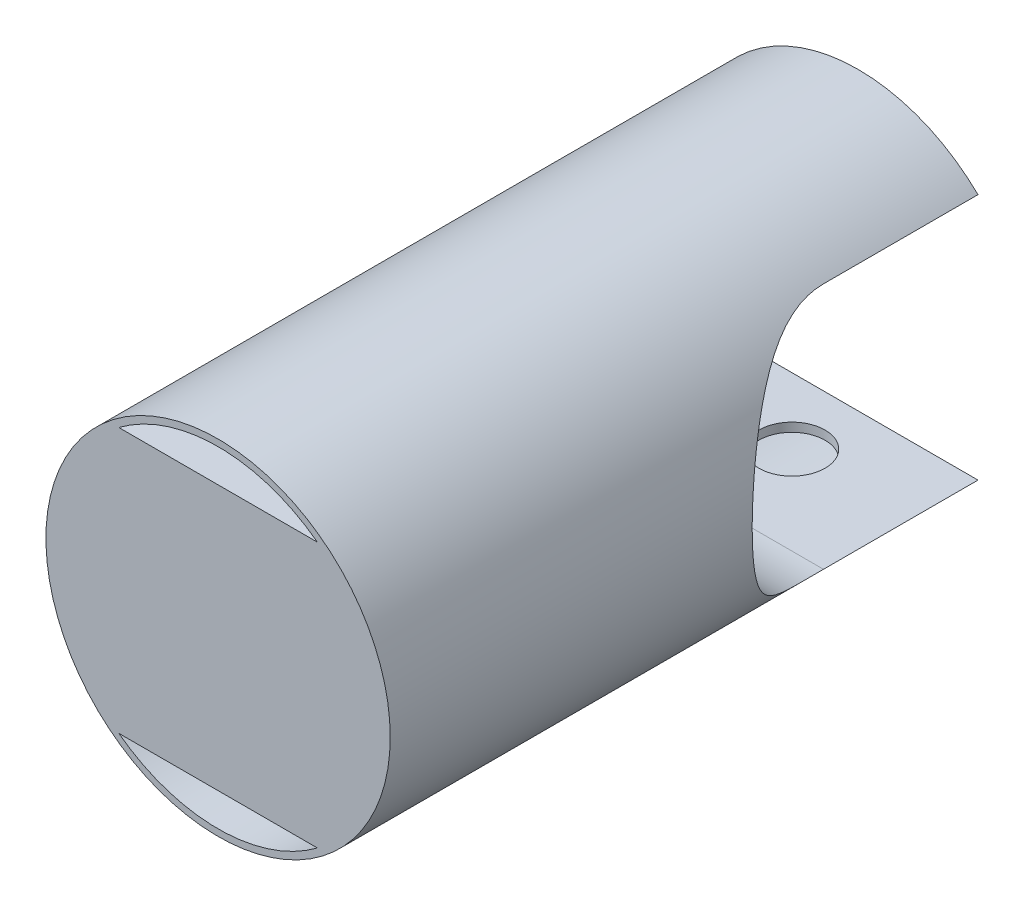
ISO-10303-21;
HEADER;
FILE_DESCRIPTION(('STEP AP214'),'2;1');
FILE_NAME('part.step','',(''),(''),'','','');
FILE_SCHEMA(('AUTOMOTIVE_DESIGN { 1 0 10303 214 1 1 1 1 }'));
ENDSEC;
DATA;
#1=APPLICATION_CONTEXT('core data for automotive mechanical design processes');
#2=APPLICATION_PROTOCOL_DEFINITION('international standard','automotive_design',2000,#1);
#3=PRODUCT_CONTEXT('',#1,'mechanical');
#4=PRODUCT('Part','Part','',(#3));
#5=PRODUCT_RELATED_PRODUCT_CATEGORY('part','',(#4));
#6=PRODUCT_DEFINITION_FORMATION('','',#4);
#7=PRODUCT_DEFINITION_CONTEXT('part definition',#1,'design');
#8=PRODUCT_DEFINITION('design','',#6,#7);
#9=PRODUCT_DEFINITION_SHAPE('','',#8);
#10=(LENGTH_UNIT() NAMED_UNIT(*) SI_UNIT(.MILLI.,.METRE.));
#11=(NAMED_UNIT(*) PLANE_ANGLE_UNIT() SI_UNIT($,.RADIAN.));
#12=(NAMED_UNIT(*) SI_UNIT($,.STERADIAN.) SOLID_ANGLE_UNIT());
#13=UNCERTAINTY_MEASURE_WITH_UNIT(LENGTH_MEASURE(1.E-05),#10,'distance_accuracy_value','');
#14=(GEOMETRIC_REPRESENTATION_CONTEXT(3) GLOBAL_UNCERTAINTY_ASSIGNED_CONTEXT((#13)) GLOBAL_UNIT_ASSIGNED_CONTEXT((#10,
#11,#12)) REPRESENTATION_CONTEXT('',''));
#15=CARTESIAN_POINT('',(0.,0.,0.));
#16=DIRECTION('',(0.,0.,1.));
#17=DIRECTION('',(1.,0.,0.));
#18=AXIS2_PLACEMENT_3D('',#15,#16,#17);
#19=CARTESIAN_POINT('',(0.,0.,0.));
#20=DIRECTION('',(0.,0.,1.));
#21=DIRECTION('',(1.,0.,0.));
#22=AXIS2_PLACEMENT_3D('',#19,#20,#21);
#23=PLANE('',#22);
#24=DIRECTION('',(1.,0.,0.));
#25=VECTOR('',#24,1.);
#26=CARTESIAN_POINT('',(0.,30.,0.));
#27=LINE('',#26,#25);
#28=CARTESIAN_POINT('',(-22.5,30.,0.));
#29=VERTEX_POINT('',#28);
#30=CARTESIAN_POINT('',(22.5,30.,0.));
#31=VERTEX_POINT('',#30);
#32=EDGE_CURVE('E130',#29,#31,#27,.T.);
#33=ORIENTED_EDGE('',*,*,#32,.T.);
#34=CARTESIAN_POINT('',(0.,0.,0.));
#35=DIRECTION('',(0.,0.,1.));
#36=DIRECTION('',(1.,0.,0.));
#37=AXIS2_PLACEMENT_3D('',#34,#35,#36);
#38=CIRCLE('',#37,37.5);
#39=EDGE_CURVE('E133',#31,#29,#38,.T.);
#40=ORIENTED_EDGE('',*,*,#39,.T.);
#41=EDGE_LOOP('',(#33,#40));
#42=FACE_BOUND('',#41,.T.);
#43=CARTESIAN_POINT('',(0.,0.,0.));
#44=DIRECTION('',(0.,0.,1.));
#45=DIRECTION('',(1.,0.,0.));
#46=AXIS2_PLACEMENT_3D('',#43,#44,#45);
#47=CIRCLE('',#46,39.);
#48=CARTESIAN_POINT('',(27.1477439209965,28.,0.));
#49=VERTEX_POINT('',#48);
#50=CARTESIAN_POINT('',(-27.1477439209965,28.,0.));
#51=VERTEX_POINT('',#50);
#52=EDGE_CURVE('E185',#49,#51,#47,.T.);
#53=ORIENTED_EDGE('',*,*,#52,.F.);
#54=DIRECTION('',(-1.,0.,0.));
#55=VECTOR('',#54,1.);
#56=CARTESIAN_POINT('',(0.,28.,0.));
#57=LINE('',#56,#55);
#58=EDGE_CURVE('E46',#49,#51,#57,.T.);
#59=ORIENTED_EDGE('',*,*,#58,.T.);
#60=EDGE_LOOP('',(#53,#59));
#61=FACE_BOUND('',#60,.T.);
#62=ADVANCED_FACE('F37',(#42,#61),#23,.F.);
#63=CARTESIAN_POINT('',(0.,0.,145.));
#64=DIRECTION('',(0.,0.,-1.));
#65=DIRECTION('',(-1.,0.,0.));
#66=AXIS2_PLACEMENT_3D('',#63,#64,#65);
#67=CYLINDRICAL_SURFACE('',#66,39.);
#68=CARTESIAN_POINT('',(0.,0.,145.));
#69=DIRECTION('',(0.,0.,1.));
#70=DIRECTION('',(1.,0.,0.));
#71=AXIS2_PLACEMENT_3D('',#68,#69,#70);
#72=CIRCLE('',#71,39.);
#73=CARTESIAN_POINT('',(39.,0.,145.));
#74=VERTEX_POINT('',#73);
#75=EDGE_CURVE('E189',#74,#74,#72,.T.);
#76=ORIENTED_EDGE('',*,*,#75,.F.);
#77=EDGE_LOOP('',(#76));
#78=FACE_BOUND('',#77,.T.);
#79=CARTESIAN_POINT('',(39.,0.,63.));
#80=CARTESIAN_POINT('',(39.0000026610636,0.692124637936485,63.0000028327298));
#81=CARTESIAN_POINT('',(38.9815388813387,1.38421584483747,62.9743031819958));
#82=CARTESIAN_POINT('',(38.9081504730498,2.76262539698867,62.871947432724));
#83=CARTESIAN_POINT('',(38.8532281538022,3.44894410508601,62.7952945616081));
#84=CARTESIAN_POINT('',(38.708232350775,4.81058641949559,62.5922505690083));
#85=CARTESIAN_POINT('',(38.6181483743368,5.48590668101644,62.465844600511));
#86=CARTESIAN_POINT('',(38.4049214408412,6.82046224940038,62.1652205891098));
#87=CARTESIAN_POINT('',(38.2817775118207,7.47969708273001,61.9910011404858));
#88=CARTESIAN_POINT('',(38.0058339837218,8.77454368572793,61.5981737768166));
#89=CARTESIAN_POINT('',(37.8531888949309,9.41025882097758,61.3797968690784));
#90=CARTESIAN_POINT('',(37.5209241641779,10.658201024066,60.9007628012948));
#91=CARTESIAN_POINT('',(37.3413047573936,11.2704282966272,60.6401060098682));
#92=CARTESIAN_POINT('',(36.9584384675143,12.46874095461,60.0792378673774));
#93=CARTESIAN_POINT('',(36.7551919176368,13.0548267085484,59.7790270741416));
#94=CARTESIAN_POINT('',(36.3285651503581,14.1988785961172,59.141679658016));
#95=CARTESIAN_POINT('',(36.1051839445667,14.7568433472171,58.8045412222099));
#96=CARTESIAN_POINT('',(35.6210340047735,15.8920142342519,58.0639015895301));
#97=CARTESIAN_POINT('',(35.3587094915667,16.4664409731788,57.6571591564337));
#98=CARTESIAN_POINT('',(34.8191052852505,17.5787394957036,56.8054733213147));
#99=CARTESIAN_POINT('',(34.541824864907,18.1166094988433,56.360528061048));
#100=CARTESIAN_POINT('',(33.9767173742283,19.1554895834412,55.4340963657595));
#101=CARTESIAN_POINT('',(33.6888762265339,19.6564475737781,54.9525601670058));
#102=CARTESIAN_POINT('',(33.107992026515,20.6198282172315,53.9553003294653));
#103=CARTESIAN_POINT('',(32.8149486843545,21.0822487150375,53.4395747814416));
#104=CARTESIAN_POINT('',(32.1743714619999,22.0500820023418,52.2762293705415));
#105=CARTESIAN_POINT('',(31.8268418512232,22.547490188065,51.6219207260547));
#106=CARTESIAN_POINT('',(31.1413794376193,23.4851407154712,50.2684679855663));
#107=CARTESIAN_POINT('',(30.8034493027458,23.9253672839688,49.5693115977129));
#108=CARTESIAN_POINT('',(30.1486225731739,24.7454138328814,48.1282526689309));
#109=CARTESIAN_POINT('',(29.8317011565603,25.1253058676929,47.3864025801973));
#110=CARTESIAN_POINT('',(29.2312007848053,25.8214664966004,45.8606700609138));
#111=CARTESIAN_POINT('',(28.9476036471078,26.1377698538679,45.076810894737));
#112=CARTESIAN_POINT('',(28.5121703842588,26.6105912953908,43.7297376441368));
#113=CARTESIAN_POINT('',(28.3473890461957,26.7856977139033,43.1771796951025));
#114=CARTESIAN_POINT('',(28.0444004339599,27.1027618968687,42.0554799816854));
#115=CARTESIAN_POINT('',(27.9061889181048,27.2447249532,41.4863408810989));
#116=CARTESIAN_POINT('',(27.6612492899566,27.4933770484771,40.3348346392674));
#117=CARTESIAN_POINT('',(27.5544630912269,27.6001312120885,39.7524940738783));
#118=CARTESIAN_POINT('',(27.3762028574204,27.7769573582757,38.5768553288156));
#119=CARTESIAN_POINT('',(27.3047287728776,27.8470293922366,37.9835571644929));
#120=CARTESIAN_POINT('',(27.199863270364,27.9494709236467,36.7861984101292));
#121=CARTESIAN_POINT('',(27.1667355255247,27.9815794120525,36.1820919735026));
#122=CARTESIAN_POINT('',(27.14102104006,28.0065226884135,34.9722143934562));
#123=CARTESIAN_POINT('',(27.1484329870293,27.9993587477486,34.3664433045614));
#124=CARTESIAN_POINT('',(27.2034577951029,27.9458999285814,33.1580705131129));
#125=CARTESIAN_POINT('',(27.2510984463809,27.8995779995367,32.5554712913329));
#126=CARTESIAN_POINT('',(27.3843963971215,27.7687496504236,31.3587011813297));
#127=CARTESIAN_POINT('',(27.4700579948154,27.6842389131279,30.7645312538695));
#128=CARTESIAN_POINT('',(27.6885562049167,27.4658073417692,29.5154942026279));
#129=CARTESIAN_POINT('',(27.8259357725411,27.3270476956264,28.862271433632));
#130=CARTESIAN_POINT('',(28.1376872317888,27.0059340027621,27.5757560015394));
#131=CARTESIAN_POINT('',(28.3120647116067,26.8235733699834,26.9424663657711));
#132=CARTESIAN_POINT('',(28.6912366262835,26.4176102804025,25.6973387854608));
#133=CARTESIAN_POINT('',(28.8960868221698,26.1939320325336,25.0855427630964));
#134=CARTESIAN_POINT('',(29.3292507542327,25.7079953318367,23.8861445160571));
#135=CARTESIAN_POINT('',(29.5575665861936,25.4457334320862,23.2985444589703));
#136=CARTESIAN_POINT('',(30.1067248065143,24.7955422490142,21.9657420468813));
#137=CARTESIAN_POINT('',(30.4339347842966,24.3941464813334,21.2297097728718));
#138=CARTESIAN_POINT('',(31.105915659169,23.5312831739085,19.8021492352274));
#139=CARTESIAN_POINT('',(31.4506916436716,23.0697981704127,19.1106339972453));
#140=CARTESIAN_POINT('',(32.1472921848713,22.0887719268916,17.7728512844802));
#141=CARTESIAN_POINT('',(32.4991224486433,21.5691819835716,17.126622517789));
#142=CARTESIAN_POINT('',(33.1999431420482,20.4740431608154,15.8819295587248));
#143=CARTESIAN_POINT('',(33.5489338642229,19.8985001270859,15.2834603885317));
#144=CARTESIAN_POINT('',(34.2390190081888,18.6863867960931,14.1307468185303));
#145=CARTESIAN_POINT('',(34.5799893887016,18.0492306864368,13.5770426383918));
#146=CARTESIAN_POINT('',(35.2415268204184,16.720812084751,12.5248466311015));
#147=CARTESIAN_POINT('',(35.5620918107511,16.0295441432912,12.0263603770112));
#148=CARTESIAN_POINT('',(36.1738518741793,14.5964968660522,11.0903204474324));
#149=CARTESIAN_POINT('',(36.465102725648,13.854818137674,10.6526504237158));
#150=CARTESIAN_POINT('',(36.87414756659,12.7067889806278,10.0455416956756));
#151=CARTESIAN_POINT('',(37.0058465357597,12.3182311260715,9.85142028425292));
#152=CARTESIAN_POINT('',(37.2590742005733,11.5296523862216,9.48026168579437));
#153=CARTESIAN_POINT('',(37.3806003534072,11.1296286682509,9.30322876853689));
#154=CARTESIAN_POINT('',(37.6689887002913,10.121283722037,8.88514730481906));
#155=CARTESIAN_POINT('',(37.8290810365736,9.50646007853193,8.65494887003213));
#156=CARTESIAN_POINT('',(38.1214548436868,8.25631277703023,8.23682294921956));
#157=CARTESIAN_POINT('',(38.2537423284692,7.6209935864065,8.04888632171094));
#158=CARTESIAN_POINT('',(38.4878269895827,6.33363070152342,7.71765111779461));
#159=CARTESIAN_POINT('',(38.5896401387526,5.68159596382048,7.57432915544488));
#160=CARTESIAN_POINT('',(38.7606725033535,4.36475333171255,7.334193592339));
#161=CARTESIAN_POINT('',(38.8298908186358,3.6999450850781,7.23738127600576));
#162=CARTESIAN_POINT('',(38.9343359049962,2.36017428614593,7.0914865457536));
#163=CARTESIAN_POINT('',(38.9694482657465,1.68518521716494,7.0425647791014));
#164=CARTESIAN_POINT('',(39.0044503969232,0.33251826546885,6.99379637694701));
#165=CARTESIAN_POINT('',(39.0043402394116,-0.345159611742342,6.99394964104165));
#166=CARTESIAN_POINT('',(38.9688996421112,-1.69784367396269,7.04332939580377));
#167=CARTESIAN_POINT('',(38.9335663759143,-2.37284964020575,7.09255982457048));
#168=CARTESIAN_POINT('',(38.8285057591689,-3.71485413532504,7.23931767483063));
#169=CARTESIAN_POINT('',(38.7587791119185,-4.38185282765348,7.33684410873647));
#170=CARTESIAN_POINT('',(38.5908513000108,-5.66980263661009,7.57263632651303));
#171=CARTESIAN_POINT('',(38.4942534083896,-6.29138557423201,7.70861387629631));
#172=CARTESIAN_POINT('',(38.2733680803712,-7.51920061745279,8.02106542222191));
#173=CARTESIAN_POINT('',(38.149081792952,-8.12543335887245,8.19753773797286));
#174=CARTESIAN_POINT('',(37.8750963784416,-9.31946083397191,8.58897086505218));
#175=CARTESIAN_POINT('',(37.7253949990027,-9.90725392801021,8.80393508772011));
#176=CARTESIAN_POINT('',(37.4031573549767,-11.0617856590684,9.2701621391572));
#177=CARTESIAN_POINT('',(37.2306197720378,-11.6285230781067,9.52142706367105));
#178=CARTESIAN_POINT('',(36.8492378653406,-12.7882208318174,10.0818903343462));
#179=CARTESIAN_POINT('',(36.6385298569248,-13.3790384083497,10.3942522589166));
#180=CARTESIAN_POINT('',(36.1970051917088,-14.531261378437,11.0566471745277));
#181=CARTESIAN_POINT('',(35.9661875594172,-15.0926653430586,11.406681993225));
#182=CARTESIAN_POINT('',(35.4880826492587,-16.1849187883584,12.1421314656885));
#183=CARTESIAN_POINT('',(35.2407857263825,-16.715750030535,12.5275668895552));
#184=CARTESIAN_POINT('',(34.7336824260474,-17.7454427345512,13.3314522285671));
#185=CARTESIAN_POINT('',(34.4738754034699,-18.2443025445951,13.7499038469976));
#186=CARTESIAN_POINT('',(33.8976468822037,-19.296939963031,14.6968889353503));
#187=CARTESIAN_POINT('',(33.5795155107402,-19.8442280812716,15.2316097241104));
#188=CARTESIAN_POINT('',(32.9378902879347,-20.8919318488171,16.3422888056949));
#189=CARTESIAN_POINT('',(32.6143955565276,-21.3923397142068,16.9182539187425));
#190=CARTESIAN_POINT('',(31.9690275680434,-22.3453037704146,18.1100640701929));
#191=CARTESIAN_POINT('',(31.6471554648052,-22.7978295225458,18.7259340798712));
#192=CARTESIAN_POINT('',(31.0131633491871,-23.6530525596973,19.9960296356406));
#193=CARTESIAN_POINT('',(30.7010417329402,-24.055758072301,20.6502488221699));
#194=CARTESIAN_POINT('',(30.139736208305,-24.7541250652467,21.8978290224601));
#195=CARTESIAN_POINT('',(29.8880205523411,-25.0568294120923,22.4861116684183));
#196=CARTESIAN_POINT('',(29.4044958866962,-25.6225302362712,23.6894784619492));
#197=CARTESIAN_POINT('',(29.1726868870132,-25.8855266936616,24.3045626229826));
#198=CARTESIAN_POINT('',(28.7363984831913,-26.3690217370343,25.5593461536721));
#199=CARTESIAN_POINT('',(28.5318723457638,-26.5895932874662,26.1990009500413));
#200=CARTESIAN_POINT('',(28.1572902951255,-26.9859500044433,27.5018837011271));
#201=CARTESIAN_POINT('',(27.9872255947728,-27.1617465908673,28.1651055957689));
#202=CARTESIAN_POINT('',(27.7181240778243,-27.4360164119103,29.3808909331272));
#203=CARTESIAN_POINT('',(27.6117074965966,-27.5428757459626,29.9299344363352));
#204=CARTESIAN_POINT('',(27.4298238302203,-27.7240205773417,31.038444954536));
#205=CARTESIAN_POINT('',(27.3543528270422,-27.7983101984129,31.5979106405903));
#206=CARTESIAN_POINT('',(27.2373031615743,-27.9130090851952,32.723277504621));
#207=CARTESIAN_POINT('',(27.1956899005787,-27.9534529385855,33.2891715122837));
#208=CARTESIAN_POINT('',(27.1479395895867,-27.9998305580728,34.423894745306));
#209=CARTESIAN_POINT('',(27.1418029864982,-28.0057638894326,34.9927240075513));
#210=CARTESIAN_POINT('',(27.1652744880456,-27.9829969127398,36.1291779061756));
#211=CARTESIAN_POINT('',(27.1948975916678,-27.9542820719233,36.6968019369702));
#212=CARTESIAN_POINT('',(27.2886697393525,-27.8627484031369,37.8263727166209));
#213=CARTESIAN_POINT('',(27.3528186710311,-27.7999296861776,38.3883194839509));
#214=CARTESIAN_POINT('',(27.5132220003846,-27.6411884563352,39.5036016878148));
#215=CARTESIAN_POINT('',(27.6095191865239,-27.5452218185291,40.056924613408));
#216=CARTESIAN_POINT('',(27.8307566069062,-27.3216700192784,41.1512946965837));
#217=CARTESIAN_POINT('',(27.9557007898587,-27.1940804987309,41.6923401505269));
#218=CARTESIAN_POINT('',(28.2756362446052,-26.8618255786581,42.936131206314));
#219=CARTESIAN_POINT('',(28.4801395295399,-26.6456179774903,43.6333636485254));
#220=CARTESIAN_POINT('',(28.9234633071678,-26.1637219282283,44.999231957808));
#221=CARTESIAN_POINT('',(29.162295796207,-25.8980161733474,45.6678577218373));
#222=CARTESIAN_POINT('',(29.6656290048797,-25.3199031884026,46.9755681912413));
#223=CARTESIAN_POINT('',(29.9301619603276,-25.0074370349304,47.6146142731545));
#224=CARTESIAN_POINT('',(30.4765849982717,-24.3385346543871,48.861319667706));
#225=CARTESIAN_POINT('',(30.7584738073295,-23.9821016513426,49.4689812770928));
#226=CARTESIAN_POINT('',(31.3404824276869,-23.2166250948072,50.6687122278047));
#227=CARTESIAN_POINT('',(31.6408907929682,-22.8063996454335,51.2598862977083));
#228=CARTESIAN_POINT('',(32.245752301016,-21.9428666524141,52.4076524571215));
#229=CARTESIAN_POINT('',(32.5502054412511,-21.489559135732,52.9642445682745));
#230=CARTESIAN_POINT('',(33.1570972537891,-20.5407914762927,54.0418309794598));
#231=CARTESIAN_POINT('',(33.4595352677138,-20.04531822172,54.5628141150828));
#232=CARTESIAN_POINT('',(34.0565921152351,-19.0132601348932,55.5673174168331));
#233=CARTESIAN_POINT('',(34.3512101088306,-18.4766709099654,56.0508335690006));
#234=CARTESIAN_POINT('',(34.9802673136817,-17.2606977855084,57.0636452556737));
#235=CARTESIAN_POINT('',(35.3120358843917,-16.573224920835,57.5849496696845));
#236=CARTESIAN_POINT('',(35.9481131026242,-15.1441388782301,58.5670690685105));
#237=CARTESIAN_POINT('',(36.2524172303889,-14.4025168252917,59.0278741027399));
#238=CARTESIAN_POINT('',(36.8245316527043,-12.8694384212243,59.8826611453499));
#239=CARTESIAN_POINT('',(37.0923824945118,-12.0780388951583,60.2767175201485));
#240=CARTESIAN_POINT('',(37.5835348928052,-10.4498851742255,60.9921096324396));
#241=CARTESIAN_POINT('',(37.8068519595113,-9.61314689950638,61.3134706935085));
#242=CARTESIAN_POINT('',(38.1641511052896,-8.06264970936586,61.8240377484619));
#243=CARTESIAN_POINT('',(38.3070356506147,-7.35535893261894,62.0267315690323));
#244=CARTESIAN_POINT('',(38.5548295102573,-5.92069786458099,62.3768190135732));
#245=CARTESIAN_POINT('',(38.6597439063311,-5.19333027431611,62.5242200377828));
#246=CARTESIAN_POINT('',(38.8287015238699,-3.725236050979,62.761032744448));
#247=CARTESIAN_POINT('',(38.8927842490785,-2.98452304509393,62.850500477456));
#248=CARTESIAN_POINT('',(38.9784310155498,-1.49586011121588,62.9699811290935));
#249=CARTESIAN_POINT('',(38.9999971244521,-0.747910536924614,62.9999969389495));
#250=CARTESIAN_POINT('',(39.,0.,63.));
#251=B_SPLINE_CURVE_WITH_KNOTS('',3,(#79,#80,#81,#82,#83,#84,#85,#86,#87,#88,#89,#90,#91,#92,
#93,#94,#95,#96,#97,#98,#99,#100,#101,#102,#103,#104,#105,#106,#107,#108,#109,#110,#111,#112,
#113,#114,#115,#116,#117,#118,#119,#120,#121,#122,#123,#124,#125,#126,#127,#128,#129,#130,#131,
#132,#133,#134,#135,#136,#137,#138,#139,#140,#141,#142,#143,#144,#145,#146,#147,#148,#149,#150,
#151,#152,#153,#154,#155,#156,#157,#158,#159,#160,#161,#162,#163,#164,#165,#166,#167,#168,#169,
#170,#171,#172,#173,#174,#175,#176,#177,#178,#179,#180,#181,#182,#183,#184,#185,#186,#187,#188,
#189,#190,#191,#192,#193,#194,#195,#196,#197,#198,#199,#200,#201,#202,#203,#204,#205,#206,#207,
#208,#209,#210,#211,#212,#213,#214,#215,#216,#217,#218,#219,#220,#221,#222,#223,#224,#225,#226,
#227,#228,#229,#230,#231,#232,#233,#234,#235,#236,#237,#238,#239,#240,#241,#242,#243,#244,#245,
#246,#247,#248,#249,#250),.UNSPECIFIED.,.T.,.F.,(4,2,2,2,2,2,2,2,2,2,2,2,2,2,2,2,2,2,2,2,2,2,2,
2,2,2,2,2,2,2,2,2,2,2,2,2,2,2,2,2,2,2,2,2,2,2,2,2,2,2,2,2,2,2,2,2,2,2,2,2,2,2,2,2,2,2,2,2,2,2,2,
2,2,2,2,2,2,2,2,2,2,2,2,2,2,4),(0.,2.07560010266073,4.15106874750732,6.22715721108644,
8.30330671837034,10.3688636052417,12.4344024844393,14.4999122365447,16.565523437745,
18.8168259730369,21.0682380772429,23.3227688788324,25.5774256864766,28.2515058041373,
30.9263219903643,33.5979193644473,36.2680522124836,38.074376638545,39.8804124579024,
41.6830887320765,43.4857624810129,45.3007593065267,47.11569737487,48.9318902374161,
50.748288471123,52.7906485729522,54.8333173743945,56.8797710458426,58.9264076511307,
61.6226143979913,64.319606500551,67.0188763977611,69.7178645908206,72.4456607572566,
75.17373198565,77.8965100563217,79.2576509314116,80.6191310293179,82.6441414531536,
84.6687134328214,86.6922223862256,88.7157872181862,90.7461170056756,92.7764426392897,
94.8069312054509,96.8373782525974,98.7660034237481,100.694548578158,102.623264734267,
104.552092285279,106.652261362562,108.75253237307,110.854043615337,112.955663344269,
115.439118311373,117.922984898881,120.408421113519,122.893446320319,125.01530827179,
127.137171288936,129.255351734818,131.372991395406,133.079424362257,134.785641210318,
136.490112304026,138.194604869315,139.899812612338,141.605014804828,143.312495684678,
145.020212065781,147.291075685503,149.562734796893,151.837280943451,154.111660399807,
156.448906762555,158.786151662511,161.124126024196,163.462350515371,166.231596523977,
169.001297432971,171.767891954939,174.533521238243,176.779001861074,179.024181847506,
181.267186360206,183.510081789922),.UNSPECIFIED.);
#252=CARTESIAN_POINT('',(27.1477439209965,-28.,35.));
#253=VERTEX_POINT('',#252);
#254=CARTESIAN_POINT('',(27.1477439209964,28.,35.));
#255=VERTEX_POINT('',#254);
#256=EDGE_CURVE('E140',#253,#255,#251,.T.);
#257=ORIENTED_EDGE('',*,*,#256,.T.);
#258=DIRECTION('',(0.,0.,-1.));
#259=VECTOR('',#258,1.);
#260=CARTESIAN_POINT('',(27.1477439209965,28.,145.));
#261=LINE('',#260,#259);
#262=EDGE_CURVE('E196',#255,#49,#261,.T.);
#263=ORIENTED_EDGE('',*,*,#262,.T.);
#264=ORIENTED_EDGE('',*,*,#52,.T.);
#265=DIRECTION('',(0.,0.,-1.));
#266=VECTOR('',#265,1.);
#267=CARTESIAN_POINT('',(-27.1477439209965,28.,145.));
#268=LINE('',#267,#266);
#269=CARTESIAN_POINT('',(-27.1477439209965,28.,35.));
#270=VERTEX_POINT('',#269);
#271=EDGE_CURVE('E242',#51,#270,#268,.F.);
#272=ORIENTED_EDGE('',*,*,#271,.T.);
#273=CARTESIAN_POINT('',(-39.,0.,63.));
#274=CARTESIAN_POINT('',(-39.0000026610636,-0.692124637936485,63.0000028327298));
#275=CARTESIAN_POINT('',(-38.9815388813387,-1.38421584483747,62.9743031819958));
#276=CARTESIAN_POINT('',(-38.9081504730498,-2.76262539698867,62.871947432724));
#277=CARTESIAN_POINT('',(-38.8532281538022,-3.44894410508601,62.7952945616081));
#278=CARTESIAN_POINT('',(-38.708232350775,-4.81058641949559,62.5922505690083));
#279=CARTESIAN_POINT('',(-38.6181483743368,-5.48590668101644,62.465844600511));
#280=CARTESIAN_POINT('',(-38.4049214408412,-6.82046224940038,62.1652205891098));
#281=CARTESIAN_POINT('',(-38.2817775118207,-7.47969708273001,61.9910011404858));
#282=CARTESIAN_POINT('',(-38.0058339837218,-8.77454368572793,61.5981737768166));
#283=CARTESIAN_POINT('',(-37.8531888949309,-9.41025882097758,61.3797968690784));
#284=CARTESIAN_POINT('',(-37.5209241641779,-10.658201024066,60.9007628012948));
#285=CARTESIAN_POINT('',(-37.3413047573936,-11.2704282966272,60.6401060098682));
#286=CARTESIAN_POINT('',(-36.9584384675143,-12.46874095461,60.0792378673774));
#287=CARTESIAN_POINT('',(-36.7551919176368,-13.0548267085484,59.7790270741416));
#288=CARTESIAN_POINT('',(-36.3285651503581,-14.1988785961172,59.141679658016));
#289=CARTESIAN_POINT('',(-36.1051839445667,-14.7568433472171,58.8045412222099));
#290=CARTESIAN_POINT('',(-35.6210340047735,-15.8920142342519,58.0639015895301));
#291=CARTESIAN_POINT('',(-35.3587094915667,-16.4664409731788,57.6571591564337));
#292=CARTESIAN_POINT('',(-34.8191052852505,-17.5787394957036,56.8054733213147));
#293=CARTESIAN_POINT('',(-34.541824864907,-18.1166094988433,56.360528061048));
#294=CARTESIAN_POINT('',(-33.9767173742283,-19.1554895834412,55.4340963657595));
#295=CARTESIAN_POINT('',(-33.6888762265339,-19.6564475737781,54.9525601670058));
#296=CARTESIAN_POINT('',(-33.107992026515,-20.6198282172315,53.9553003294653));
#297=CARTESIAN_POINT('',(-32.8149486843545,-21.0822487150375,53.4395747814416));
#298=CARTESIAN_POINT('',(-32.1743714619999,-22.0500820023418,52.2762293705415));
#299=CARTESIAN_POINT('',(-31.8268418512232,-22.547490188065,51.6219207260547));
#300=CARTESIAN_POINT('',(-31.1413794376193,-23.4851407154712,50.2684679855663));
#301=CARTESIAN_POINT('',(-30.8034493027458,-23.9253672839688,49.5693115977129));
#302=CARTESIAN_POINT('',(-30.1486225731739,-24.7454138328814,48.1282526689309));
#303=CARTESIAN_POINT('',(-29.8317011565603,-25.1253058676929,47.3864025801973));
#304=CARTESIAN_POINT('',(-29.2312007848053,-25.8214664966004,45.8606700609138));
#305=CARTESIAN_POINT('',(-28.9476036471078,-26.1377698538679,45.076810894737));
#306=CARTESIAN_POINT('',(-28.5121703842588,-26.6105912953908,43.7297376441368));
#307=CARTESIAN_POINT('',(-28.3473890461957,-26.7856977139033,43.1771796951025));
#308=CARTESIAN_POINT('',(-28.0444004339599,-27.1027618968687,42.0554799816854));
#309=CARTESIAN_POINT('',(-27.9061889181048,-27.2447249532,41.4863408810989));
#310=CARTESIAN_POINT('',(-27.6612492899566,-27.4933770484771,40.3348346392674));
#311=CARTESIAN_POINT('',(-27.5544630912269,-27.6001312120885,39.7524940738783));
#312=CARTESIAN_POINT('',(-27.3762028574204,-27.7769573582757,38.5768553288156));
#313=CARTESIAN_POINT('',(-27.3047287728776,-27.8470293922366,37.9835571644929));
#314=CARTESIAN_POINT('',(-27.199863270364,-27.9494709236467,36.7861984101292));
#315=CARTESIAN_POINT('',(-27.1667355255247,-27.9815794120525,36.1820919735026));
#316=CARTESIAN_POINT('',(-27.14102104006,-28.0065226884135,34.9722143934562));
#317=CARTESIAN_POINT('',(-27.1484329870293,-27.9993587477486,34.3664433045614));
#318=CARTESIAN_POINT('',(-27.2034577951029,-27.9458999285814,33.1580705131129));
#319=CARTESIAN_POINT('',(-27.2510984463809,-27.8995779995367,32.5554712913329));
#320=CARTESIAN_POINT('',(-27.3843963971215,-27.7687496504236,31.3587011813297));
#321=CARTESIAN_POINT('',(-27.4700579948154,-27.6842389131279,30.7645312538695));
#322=CARTESIAN_POINT('',(-27.6885562049167,-27.4658073417692,29.5154942026279));
#323=CARTESIAN_POINT('',(-27.8259357725411,-27.3270476956264,28.862271433632));
#324=CARTESIAN_POINT('',(-28.1376872317888,-27.0059340027621,27.5757560015394));
#325=CARTESIAN_POINT('',(-28.3120647116067,-26.8235733699834,26.9424663657711));
#326=CARTESIAN_POINT('',(-28.6912366262835,-26.4176102804025,25.6973387854608));
#327=CARTESIAN_POINT('',(-28.8960868221698,-26.1939320325336,25.0855427630964));
#328=CARTESIAN_POINT('',(-29.3292507542327,-25.7079953318367,23.8861445160571));
#329=CARTESIAN_POINT('',(-29.5575665861936,-25.4457334320862,23.2985444589703));
#330=CARTESIAN_POINT('',(-30.1067248065143,-24.7955422490142,21.9657420468813));
#331=CARTESIAN_POINT('',(-30.4339347842966,-24.3941464813334,21.2297097728718));
#332=CARTESIAN_POINT('',(-31.105915659169,-23.5312831739085,19.8021492352274));
#333=CARTESIAN_POINT('',(-31.4506916436716,-23.0697981704127,19.1106339972453));
#334=CARTESIAN_POINT('',(-32.1472921848713,-22.0887719268916,17.7728512844802));
#335=CARTESIAN_POINT('',(-32.4991224486433,-21.5691819835716,17.126622517789));
#336=CARTESIAN_POINT('',(-33.1999431420482,-20.4740431608154,15.8819295587248));
#337=CARTESIAN_POINT('',(-33.5489338642229,-19.8985001270859,15.2834603885317));
#338=CARTESIAN_POINT('',(-34.2390190081888,-18.6863867960931,14.1307468185303));
#339=CARTESIAN_POINT('',(-34.5799893887016,-18.0492306864368,13.5770426383918));
#340=CARTESIAN_POINT('',(-35.2415268204184,-16.720812084751,12.5248466311015));
#341=CARTESIAN_POINT('',(-35.5620918107511,-16.0295441432912,12.0263603770112));
#342=CARTESIAN_POINT('',(-36.1738518741793,-14.5964968660522,11.0903204474324));
#343=CARTESIAN_POINT('',(-36.465102725648,-13.854818137674,10.6526504237158));
#344=CARTESIAN_POINT('',(-36.87414756659,-12.7067889806278,10.0455416956756));
#345=CARTESIAN_POINT('',(-37.0058465357597,-12.3182311260715,9.85142028425292));
#346=CARTESIAN_POINT('',(-37.2590742005733,-11.5296523862216,9.48026168579437));
#347=CARTESIAN_POINT('',(-37.3806003534072,-11.1296286682509,9.30322876853689));
#348=CARTESIAN_POINT('',(-37.6689887002913,-10.121283722037,8.88514730481906));
#349=CARTESIAN_POINT('',(-37.8290810365736,-9.50646007853193,8.65494887003213));
#350=CARTESIAN_POINT('',(-38.1214548436868,-8.25631277703023,8.23682294921956));
#351=CARTESIAN_POINT('',(-38.2537423284692,-7.6209935864065,8.04888632171094));
#352=CARTESIAN_POINT('',(-38.4878269895827,-6.33363070152342,7.71765111779461));
#353=CARTESIAN_POINT('',(-38.5896401387526,-5.68159596382048,7.57432915544488));
#354=CARTESIAN_POINT('',(-38.7606725033535,-4.36475333171255,7.334193592339));
#355=CARTESIAN_POINT('',(-38.8298908186358,-3.6999450850781,7.23738127600576));
#356=CARTESIAN_POINT('',(-38.9343359049962,-2.36017428614593,7.0914865457536));
#357=CARTESIAN_POINT('',(-38.9694482657465,-1.68518521716494,7.0425647791014));
#358=CARTESIAN_POINT('',(-39.0044503969232,-0.33251826546885,6.99379637694701));
#359=CARTESIAN_POINT('',(-39.0043402394116,0.345159611742342,6.99394964104165));
#360=CARTESIAN_POINT('',(-38.9688996421112,1.69784367396269,7.04332939580377));
#361=CARTESIAN_POINT('',(-38.9335663759143,2.37284964020575,7.09255982457048));
#362=CARTESIAN_POINT('',(-38.8285057591689,3.71485413532504,7.23931767483063));
#363=CARTESIAN_POINT('',(-38.7587791119185,4.38185282765348,7.33684410873647));
#364=CARTESIAN_POINT('',(-38.5908513000108,5.66980263661009,7.57263632651303));
#365=CARTESIAN_POINT('',(-38.4942534083896,6.29138557423201,7.70861387629631));
#366=CARTESIAN_POINT('',(-38.2733680803712,7.51920061745279,8.02106542222191));
#367=CARTESIAN_POINT('',(-38.149081792952,8.12543335887245,8.19753773797286));
#368=CARTESIAN_POINT('',(-37.8750963784416,9.31946083397191,8.58897086505218));
#369=CARTESIAN_POINT('',(-37.7253949990027,9.90725392801021,8.80393508772011));
#370=CARTESIAN_POINT('',(-37.4031573549767,11.0617856590684,9.2701621391572));
#371=CARTESIAN_POINT('',(-37.2306197720378,11.6285230781067,9.52142706367105));
#372=CARTESIAN_POINT('',(-36.8492378653406,12.7882208318174,10.0818903343462));
#373=CARTESIAN_POINT('',(-36.6385298569248,13.3790384083497,10.3942522589166));
#374=CARTESIAN_POINT('',(-36.1970051917088,14.531261378437,11.0566471745277));
#375=CARTESIAN_POINT('',(-35.9661875594172,15.0926653430586,11.406681993225));
#376=CARTESIAN_POINT('',(-35.4880826492587,16.1849187883584,12.1421314656885));
#377=CARTESIAN_POINT('',(-35.2407857263825,16.715750030535,12.5275668895552));
#378=CARTESIAN_POINT('',(-34.7336824260474,17.7454427345512,13.3314522285671));
#379=CARTESIAN_POINT('',(-34.4738754034699,18.2443025445951,13.7499038469976));
#380=CARTESIAN_POINT('',(-33.8976468822037,19.296939963031,14.6968889353503));
#381=CARTESIAN_POINT('',(-33.5795155107402,19.8442280812716,15.2316097241104));
#382=CARTESIAN_POINT('',(-32.9378902879347,20.8919318488171,16.3422888056949));
#383=CARTESIAN_POINT('',(-32.6143955565276,21.3923397142068,16.9182539187425));
#384=CARTESIAN_POINT('',(-31.9690275680434,22.3453037704146,18.1100640701929));
#385=CARTESIAN_POINT('',(-31.6471554648052,22.7978295225458,18.7259340798712));
#386=CARTESIAN_POINT('',(-31.0131633491871,23.6530525596973,19.9960296356406));
#387=CARTESIAN_POINT('',(-30.7010417329402,24.055758072301,20.6502488221699));
#388=CARTESIAN_POINT('',(-30.139736208305,24.7541250652467,21.8978290224601));
#389=CARTESIAN_POINT('',(-29.8880205523411,25.0568294120923,22.4861116684183));
#390=CARTESIAN_POINT('',(-29.4044958866962,25.6225302362712,23.6894784619492));
#391=CARTESIAN_POINT('',(-29.1726868870132,25.8855266936616,24.3045626229826));
#392=CARTESIAN_POINT('',(-28.7363984831913,26.3690217370343,25.5593461536721));
#393=CARTESIAN_POINT('',(-28.5318723457638,26.5895932874662,26.1990009500413));
#394=CARTESIAN_POINT('',(-28.1572902951255,26.9859500044433,27.5018837011271));
#395=CARTESIAN_POINT('',(-27.9872255947728,27.1617465908673,28.1651055957689));
#396=CARTESIAN_POINT('',(-27.7181240778243,27.4360164119103,29.3808909331272));
#397=CARTESIAN_POINT('',(-27.6117074965966,27.5428757459626,29.9299344363352));
#398=CARTESIAN_POINT('',(-27.4298238302203,27.7240205773417,31.038444954536));
#399=CARTESIAN_POINT('',(-27.3543528270422,27.7983101984129,31.5979106405903));
#400=CARTESIAN_POINT('',(-27.2373031615743,27.9130090851952,32.723277504621));
#401=CARTESIAN_POINT('',(-27.1956899005787,27.9534529385855,33.2891715122837));
#402=CARTESIAN_POINT('',(-27.1479395895867,27.9998305580728,34.423894745306));
#403=CARTESIAN_POINT('',(-27.1418029864982,28.0057638894326,34.9927240075513));
#404=CARTESIAN_POINT('',(-27.1652744880456,27.9829969127398,36.1291779061756));
#405=CARTESIAN_POINT('',(-27.1948975916678,27.9542820719233,36.6968019369702));
#406=CARTESIAN_POINT('',(-27.2886697393525,27.8627484031369,37.8263727166209));
#407=CARTESIAN_POINT('',(-27.3528186710311,27.7999296861776,38.3883194839509));
#408=CARTESIAN_POINT('',(-27.5132220003846,27.6411884563352,39.5036016878148));
#409=CARTESIAN_POINT('',(-27.6095191865239,27.5452218185291,40.056924613408));
#410=CARTESIAN_POINT('',(-27.8307566069062,27.3216700192784,41.1512946965837));
#411=CARTESIAN_POINT('',(-27.9557007898587,27.1940804987309,41.6923401505269));
#412=CARTESIAN_POINT('',(-28.2756362446052,26.8618255786581,42.936131206314));
#413=CARTESIAN_POINT('',(-28.4801395295399,26.6456179774903,43.6333636485254));
#414=CARTESIAN_POINT('',(-28.9234633071678,26.1637219282283,44.999231957808));
#415=CARTESIAN_POINT('',(-29.162295796207,25.8980161733474,45.6678577218373));
#416=CARTESIAN_POINT('',(-29.6656290048797,25.3199031884026,46.9755681912413));
#417=CARTESIAN_POINT('',(-29.9301619603276,25.0074370349304,47.6146142731545));
#418=CARTESIAN_POINT('',(-30.4765849982717,24.3385346543871,48.861319667706));
#419=CARTESIAN_POINT('',(-30.7584738073295,23.9821016513426,49.4689812770928));
#420=CARTESIAN_POINT('',(-31.3404824276869,23.2166250948072,50.6687122278047));
#421=CARTESIAN_POINT('',(-31.6408907929682,22.8063996454335,51.2598862977083));
#422=CARTESIAN_POINT('',(-32.245752301016,21.9428666524141,52.4076524571215));
#423=CARTESIAN_POINT('',(-32.5502054412511,21.489559135732,52.9642445682745));
#424=CARTESIAN_POINT('',(-33.1570972537891,20.5407914762927,54.0418309794598));
#425=CARTESIAN_POINT('',(-33.4595352677138,20.04531822172,54.5628141150828));
#426=CARTESIAN_POINT('',(-34.0565921152351,19.0132601348932,55.5673174168331));
#427=CARTESIAN_POINT('',(-34.3512101088306,18.4766709099654,56.0508335690006));
#428=CARTESIAN_POINT('',(-34.9802673136817,17.2606977855084,57.0636452556737));
#429=CARTESIAN_POINT('',(-35.3120358843917,16.573224920835,57.5849496696845));
#430=CARTESIAN_POINT('',(-35.9481131026242,15.1441388782301,58.5670690685105));
#431=CARTESIAN_POINT('',(-36.2524172303889,14.4025168252917,59.0278741027399));
#432=CARTESIAN_POINT('',(-36.8245316527043,12.8694384212243,59.8826611453499));
#433=CARTESIAN_POINT('',(-37.0923824945118,12.0780388951583,60.2767175201485));
#434=CARTESIAN_POINT('',(-37.5835348928052,10.4498851742255,60.9921096324396));
#435=CARTESIAN_POINT('',(-37.8068519595113,9.61314689950638,61.3134706935085));
#436=CARTESIAN_POINT('',(-38.1641511052896,8.06264970936586,61.8240377484619));
#437=CARTESIAN_POINT('',(-38.3070356506147,7.35535893261894,62.0267315690323));
#438=CARTESIAN_POINT('',(-38.5548295102573,5.92069786458099,62.3768190135732));
#439=CARTESIAN_POINT('',(-38.6597439063311,5.19333027431611,62.5242200377828));
#440=CARTESIAN_POINT('',(-38.8287015238699,3.725236050979,62.761032744448));
#441=CARTESIAN_POINT('',(-38.8927842490785,2.98452304509393,62.850500477456));
#442=CARTESIAN_POINT('',(-38.9784310155498,1.49586011121588,62.9699811290935));
#443=CARTESIAN_POINT('',(-38.9999971244521,0.747910536924614,62.9999969389495));
#444=CARTESIAN_POINT('',(-39.,0.,63.));
#445=B_SPLINE_CURVE_WITH_KNOTS('',3,(#273,#274,#275,#276,#277,#278,#279,#280,#281,#282,#283,
#284,#285,#286,#287,#288,#289,#290,#291,#292,#293,#294,#295,#296,#297,#298,#299,#300,#301,#302,
#303,#304,#305,#306,#307,#308,#309,#310,#311,#312,#313,#314,#315,#316,#317,#318,#319,#320,#321,
#322,#323,#324,#325,#326,#327,#328,#329,#330,#331,#332,#333,#334,#335,#336,#337,#338,#339,#340,
#341,#342,#343,#344,#345,#346,#347,#348,#349,#350,#351,#352,#353,#354,#355,#356,#357,#358,#359,
#360,#361,#362,#363,#364,#365,#366,#367,#368,#369,#370,#371,#372,#373,#374,#375,#376,#377,#378,
#379,#380,#381,#382,#383,#384,#385,#386,#387,#388,#389,#390,#391,#392,#393,#394,#395,#396,#397,
#398,#399,#400,#401,#402,#403,#404,#405,#406,#407,#408,#409,#410,#411,#412,#413,#414,#415,#416,
#417,#418,#419,#420,#421,#422,#423,#424,#425,#426,#427,#428,#429,#430,#431,#432,#433,#434,#435,
#436,#437,#438,#439,#440,#441,#442,#443,#444),.UNSPECIFIED.,.T.,.F.,(4,2,2,2,2,2,2,2,2,2,2,2,2,
2,2,2,2,2,2,2,2,2,2,2,2,2,2,2,2,2,2,2,2,2,2,2,2,2,2,2,2,2,2,2,2,2,2,2,2,2,2,2,2,2,2,2,2,2,2,2,2,
2,2,2,2,2,2,2,2,2,2,2,2,2,2,2,2,2,2,2,2,2,2,2,2,4),(0.,2.07560010266073,4.15106874750732,
6.22715721108644,8.30330671837034,10.3688636052417,12.4344024844393,14.4999122365447,
16.565523437745,18.8168259730369,21.0682380772429,23.3227688788324,25.5774256864766,
28.2515058041373,30.9263219903643,33.5979193644473,36.2680522124836,38.074376638545,
39.8804124579024,41.6830887320765,43.4857624810129,45.3007593065267,47.11569737487,
48.9318902374161,50.748288471123,52.7906485729522,54.8333173743945,56.8797710458426,
58.9264076511307,61.6226143979913,64.319606500551,67.0188763977611,69.7178645908206,
72.4456607572566,75.17373198565,77.8965100563217,79.2576509314116,80.6191310293179,
82.6441414531536,84.6687134328214,86.6922223862256,88.7157872181862,90.7461170056756,
92.7764426392897,94.8069312054509,96.8373782525974,98.7660034237481,100.694548578158,
102.623264734267,104.552092285279,106.652261362562,108.75253237307,110.854043615337,
112.955663344269,115.439118311373,117.922984898881,120.408421113519,122.893446320319,
125.01530827179,127.137171288936,129.255351734818,131.372991395406,133.079424362257,
134.785641210318,136.490112304026,138.194604869315,139.899812612338,141.605014804828,
143.312495684678,145.020212065781,147.291075685503,149.562734796893,151.837280943451,
154.111660399807,156.448906762555,158.786151662511,161.124126024196,163.462350515371,
166.231596523977,169.001297432971,171.767891954939,174.533521238243,176.779001861074,
179.024181847506,181.267186360206,183.510081789922),.UNSPECIFIED.);
#446=CARTESIAN_POINT('',(-27.1477439209965,-28.,35.));
#447=VERTEX_POINT('',#446);
#448=EDGE_CURVE('E141',#270,#447,#445,.T.);
#449=ORIENTED_EDGE('',*,*,#448,.T.);
#450=DIRECTION('',(0.,0.,-1.));
#451=VECTOR('',#450,1.);
#452=CARTESIAN_POINT('',(-27.1477439209965,-28.,145.));
#453=LINE('',#452,#451);
#454=CARTESIAN_POINT('',(-27.1477439209965,-28.,0.));
#455=VERTEX_POINT('',#454);
#456=EDGE_CURVE('E243',#447,#455,#453,.T.);
#457=ORIENTED_EDGE('',*,*,#456,.T.);
#458=CARTESIAN_POINT('',(27.1477439209965,-28.,0.));
#459=VERTEX_POINT('',#458);
#460=EDGE_CURVE('E190',#455,#459,#47,.T.);
#461=ORIENTED_EDGE('',*,*,#460,.T.);
#462=DIRECTION('',(0.,0.,-1.));
#463=VECTOR('',#462,1.);
#464=CARTESIAN_POINT('',(27.1477439209965,-28.,145.));
#465=LINE('',#464,#463);
#466=EDGE_CURVE('E236',#459,#253,#465,.F.);
#467=ORIENTED_EDGE('',*,*,#466,.T.);
#468=EDGE_LOOP('',(#257,#263,#264,#272,#449,#457,#461,#467));
#469=FACE_BOUND('',#468,.T.);
#470=ADVANCED_FACE('F39',(#78,#469),#67,.T.);
#471=CARTESIAN_POINT('',(0.,0.,145.));
#472=DIRECTION('',(0.,0.,1.));
#473=DIRECTION('',(1.,0.,0.));
#474=AXIS2_PLACEMENT_3D('',#471,#472,#473);
#475=PLANE('',#474);
#476=CARTESIAN_POINT('',(0.,0.,145.));
#477=DIRECTION('',(0.,0.,-1.));
#478=DIRECTION('',(-1.,0.,0.));
#479=AXIS2_PLACEMENT_3D('',#476,#477,#478);
#480=CIRCLE('',#479,37.5);
#481=CARTESIAN_POINT('',(22.5,-30.,145.));
#482=VERTEX_POINT('',#481);
#483=CARTESIAN_POINT('',(-22.5,-30.,145.));
#484=VERTEX_POINT('',#483);
#485=EDGE_CURVE('E53',#482,#484,#480,.T.);
#486=ORIENTED_EDGE('',*,*,#485,.T.);
#487=DIRECTION('',(1.,0.,0.));
#488=VECTOR('',#487,1.);
#489=CARTESIAN_POINT('',(22.5,-30.,145.));
#490=LINE('',#489,#488);
#491=EDGE_CURVE('E104',#484,#482,#490,.T.);
#492=ORIENTED_EDGE('',*,*,#491,.T.);
#493=EDGE_LOOP('',(#486,#492));
#494=FACE_BOUND('',#493,.T.);
#495=CARTESIAN_POINT('',(0.,0.,145.));
#496=DIRECTION('',(0.,0.,-1.));
#497=DIRECTION('',(-1.,0.,0.));
#498=AXIS2_PLACEMENT_3D('',#495,#496,#497);
#499=CIRCLE('',#498,37.5);
#500=CARTESIAN_POINT('',(-22.5,30.,145.));
#501=VERTEX_POINT('',#500);
#502=CARTESIAN_POINT('',(22.5,30.,145.));
#503=VERTEX_POINT('',#502);
#504=EDGE_CURVE('E118',#501,#503,#499,.T.);
#505=ORIENTED_EDGE('',*,*,#504,.T.);
#506=DIRECTION('',(-1.,0.,0.));
#507=VECTOR('',#506,1.);
#508=CARTESIAN_POINT('',(22.5,30.,145.));
#509=LINE('',#508,#507);
#510=EDGE_CURVE('E121',#503,#501,#509,.T.);
#511=ORIENTED_EDGE('',*,*,#510,.T.);
#512=EDGE_LOOP('',(#505,#511));
#513=FACE_BOUND('',#512,.T.);
#514=ORIENTED_EDGE('',*,*,#75,.T.);
#515=EDGE_LOOP('',(#514));
#516=FACE_BOUND('',#515,.T.);
#517=ADVANCED_FACE('F110',(#494,#513,#516),#475,.T.);
#518=DIRECTION('',(-1.,0.,0.));
#519=VECTOR('',#518,1.);
#520=CARTESIAN_POINT('',(0.,-30.,0.));
#521=LINE('',#520,#519);
#522=CARTESIAN_POINT('',(22.5,-30.,0.));
#523=VERTEX_POINT('',#522);
#524=CARTESIAN_POINT('',(-22.5,-30.,0.));
#525=VERTEX_POINT('',#524);
#526=EDGE_CURVE('E116',#523,#525,#521,.T.);
#527=ORIENTED_EDGE('',*,*,#526,.T.);
#528=CARTESIAN_POINT('',(0.,0.,0.));
#529=DIRECTION('',(0.,0.,1.));
#530=DIRECTION('',(1.,0.,0.));
#531=AXIS2_PLACEMENT_3D('',#528,#529,#530);
#532=CIRCLE('',#531,37.5);
#533=EDGE_CURVE('E12',#525,#523,#532,.T.);
#534=ORIENTED_EDGE('',*,*,#533,.T.);
#535=EDGE_LOOP('',(#527,#534));
#536=FACE_BOUND('',#535,.T.);
#537=ORIENTED_EDGE('',*,*,#460,.F.);
#538=DIRECTION('',(1.,0.,0.));
#539=VECTOR('',#538,1.);
#540=CARTESIAN_POINT('',(0.,-28.,0.));
#541=LINE('',#540,#539);
#542=EDGE_CURVE('E193',#455,#459,#541,.T.);
#543=ORIENTED_EDGE('',*,*,#542,.T.);
#544=EDGE_LOOP('',(#537,#543));
#545=FACE_BOUND('',#544,.T.);
#546=ADVANCED_FACE('F164',(#536,#545),#23,.F.);
#547=CARTESIAN_POINT('',(-39.,28.,35.));
#548=DIRECTION('',(0.,1.,0.));
#549=DIRECTION('',(0.,0.,1.));
#550=AXIS2_PLACEMENT_3D('',#547,#548,#549);
#551=PLANE('',#550);
#552=CARTESIAN_POINT('',(0.,28.,15.));
#553=DIRECTION('',(0.,1.,0.));
#554=DIRECTION('',(0.,0.,1.));
#555=AXIS2_PLACEMENT_3D('',#552,#553,#554);
#556=CIRCLE('',#555,7.5);
#557=CARTESIAN_POINT('',(0.,28.,22.5));
#558=VERTEX_POINT('',#557);
#559=EDGE_CURVE('E137',#558,#558,#556,.T.);
#560=ORIENTED_EDGE('',*,*,#559,.T.);
#561=EDGE_LOOP('',(#560));
#562=FACE_BOUND('',#561,.T.);
#563=DIRECTION('',(1.,0.,0.));
#564=VECTOR('',#563,1.);
#565=CARTESIAN_POINT('',(-39.,28.,35.));
#566=LINE('',#565,#564);
#567=EDGE_CURVE('E240',#270,#255,#566,.T.);
#568=ORIENTED_EDGE('',*,*,#567,.F.);
#569=ORIENTED_EDGE('',*,*,#271,.F.);
#570=ORIENTED_EDGE('',*,*,#58,.F.);
#571=ORIENTED_EDGE('',*,*,#262,.F.);
#572=EDGE_LOOP('',(#568,#569,#570,#571));
#573=FACE_BOUND('',#572,.T.);
#574=ADVANCED_FACE('F160',(#562,#573),#551,.F.);
#575=CARTESIAN_POINT('',(-39.,-28.,35.));
#576=DIRECTION('',(0.,-1.,0.));
#577=DIRECTION('',(0.,0.,-1.));
#578=AXIS2_PLACEMENT_3D('',#575,#576,#577);
#579=PLANE('',#578);
#580=CARTESIAN_POINT('',(0.,-28.,15.));
#581=DIRECTION('',(0.,-1.,0.));
#582=DIRECTION('',(0.,0.,-1.));
#583=AXIS2_PLACEMENT_3D('',#580,#581,#582);
#584=CIRCLE('',#583,7.5);
#585=CARTESIAN_POINT('',(0.,-28.,7.5));
#586=VERTEX_POINT('',#585);
#587=EDGE_CURVE('E136',#586,#586,#584,.T.);
#588=ORIENTED_EDGE('',*,*,#587,.T.);
#589=EDGE_LOOP('',(#588));
#590=FACE_BOUND('',#589,.T.);
#591=DIRECTION('',(1.,0.,0.));
#592=VECTOR('',#591,1.);
#593=CARTESIAN_POINT('',(-39.,-28.,35.));
#594=LINE('',#593,#592);
#595=EDGE_CURVE('E146',#447,#253,#594,.T.);
#596=ORIENTED_EDGE('',*,*,#595,.T.);
#597=ORIENTED_EDGE('',*,*,#466,.F.);
#598=ORIENTED_EDGE('',*,*,#542,.F.);
#599=ORIENTED_EDGE('',*,*,#456,.F.);
#600=EDGE_LOOP('',(#596,#597,#598,#599));
#601=FACE_BOUND('',#600,.T.);
#602=ADVANCED_FACE('F156',(#590,#601),#579,.F.);
#603=CARTESIAN_POINT('',(39.,0.,35.));
#604=DIRECTION('',(-1.,0.,0.));
#605=DIRECTION('',(0.,0.,1.));
#606=AXIS2_PLACEMENT_3D('',#603,#604,#605);
#607=CYLINDRICAL_SURFACE('',#606,28.);
#608=ORIENTED_EDGE('',*,*,#567,.T.);
#609=ORIENTED_EDGE('',*,*,#256,.F.);
#610=ORIENTED_EDGE('',*,*,#595,.F.);
#611=ORIENTED_EDGE('',*,*,#448,.F.);
#612=EDGE_LOOP('',(#608,#609,#610,#611));
#613=FACE_BOUND('',#612,.T.);
#614=ADVANCED_FACE('F150',(#613),#607,.F.);
#615=CARTESIAN_POINT('',(0.,-49.001,15.));
#616=DIRECTION('',(0.,1.,0.));
#617=DIRECTION('',(0.,0.,1.));
#618=AXIS2_PLACEMENT_3D('',#615,#616,#617);
#619=CYLINDRICAL_SURFACE('',#618,7.5);
#620=CARTESIAN_POINT('',(0.,-30.,15.));
#621=DIRECTION('',(0.,1.,0.));
#622=DIRECTION('',(0.,0.,1.));
#623=AXIS2_PLACEMENT_3D('',#620,#621,#622);
#624=CIRCLE('',#623,7.5);
#625=CARTESIAN_POINT('',(0.,-30.,22.5));
#626=VERTEX_POINT('',#625);
#627=EDGE_CURVE('E114',#626,#626,#624,.F.);
#628=ORIENTED_EDGE('',*,*,#627,.T.);
#629=EDGE_LOOP('',(#628));
#630=FACE_BOUND('',#629,.T.);
#631=ORIENTED_EDGE('',*,*,#587,.F.);
#632=EDGE_LOOP('',(#631));
#633=FACE_BOUND('',#632,.T.);
#634=ADVANCED_FACE('F155',(#630,#633),#619,.F.);
#635=CARTESIAN_POINT('',(0.,30.,15.));
#636=DIRECTION('',(0.,-1.,0.));
#637=DIRECTION('',(0.,0.,-1.));
#638=AXIS2_PLACEMENT_3D('',#635,#636,#637);
#639=CIRCLE('',#638,7.5);
#640=CARTESIAN_POINT('',(0.,30.,7.5));
#641=VERTEX_POINT('',#640);
#642=EDGE_CURVE('E128',#641,#641,#639,.F.);
#643=ORIENTED_EDGE('',*,*,#642,.T.);
#644=EDGE_LOOP('',(#643));
#645=FACE_BOUND('',#644,.T.);
#646=ORIENTED_EDGE('',*,*,#559,.F.);
#647=EDGE_LOOP('',(#646));
#648=FACE_BOUND('',#647,.T.);
#649=ADVANCED_FACE('F158',(#645,#648),#619,.F.);
#650=CARTESIAN_POINT('',(0.,0.,145.));
#651=DIRECTION('',(0.,0.,-1.));
#652=DIRECTION('',(-1.,0.,0.));
#653=AXIS2_PLACEMENT_3D('',#650,#651,#652);
#654=CYLINDRICAL_SURFACE('',#653,37.5);
#655=DIRECTION('',(0.,0.,-1.));
#656=VECTOR('',#655,1.);
#657=CARTESIAN_POINT('',(22.5,30.,145.));
#658=LINE('',#657,#656);
#659=EDGE_CURVE('E124',#503,#31,#658,.T.);
#660=ORIENTED_EDGE('',*,*,#659,.F.);
#661=ORIENTED_EDGE('',*,*,#504,.F.);
#662=DIRECTION('',(0.,0.,-1.));
#663=VECTOR('',#662,1.);
#664=CARTESIAN_POINT('',(-22.5,30.,145.));
#665=LINE('',#664,#663);
#666=EDGE_CURVE('E125',#501,#29,#665,.T.);
#667=ORIENTED_EDGE('',*,*,#666,.T.);
#668=ORIENTED_EDGE('',*,*,#39,.F.);
#669=EDGE_LOOP('',(#660,#661,#667,#668));
#670=FACE_BOUND('',#669,.T.);
#671=ADVANCED_FACE('F219',(#670),#654,.F.);
#672=CARTESIAN_POINT('',(22.5,30.,145.));
#673=DIRECTION('',(0.,-1.,0.));
#674=DIRECTION('',(0.,0.,-1.));
#675=AXIS2_PLACEMENT_3D('',#672,#673,#674);
#676=PLANE('',#675);
#677=ORIENTED_EDGE('',*,*,#642,.F.);
#678=EDGE_LOOP('',(#677));
#679=FACE_BOUND('',#678,.T.);
#680=ORIENTED_EDGE('',*,*,#666,.F.);
#681=ORIENTED_EDGE('',*,*,#510,.F.);
#682=ORIENTED_EDGE('',*,*,#659,.T.);
#683=ORIENTED_EDGE('',*,*,#32,.F.);
#684=EDGE_LOOP('',(#680,#681,#682,#683));
#685=FACE_BOUND('',#684,.T.);
#686=ADVANCED_FACE('F215',(#679,#685),#676,.F.);
#687=CARTESIAN_POINT('',(0.,0.,145.));
#688=DIRECTION('',(0.,0.,-1.));
#689=DIRECTION('',(-1.,0.,0.));
#690=AXIS2_PLACEMENT_3D('',#687,#688,#689);
#691=CYLINDRICAL_SURFACE('',#690,37.5);
#692=DIRECTION('',(0.,0.,-1.));
#693=VECTOR('',#692,1.);
#694=CARTESIAN_POINT('',(-22.5,-30.,145.));
#695=LINE('',#694,#693);
#696=EDGE_CURVE('E60',#484,#525,#695,.T.);
#697=ORIENTED_EDGE('',*,*,#696,.F.);
#698=ORIENTED_EDGE('',*,*,#485,.F.);
#699=DIRECTION('',(0.,0.,-1.));
#700=VECTOR('',#699,1.);
#701=CARTESIAN_POINT('',(22.5,-30.,145.));
#702=LINE('',#701,#700);
#703=EDGE_CURVE('E103',#482,#523,#702,.T.);
#704=ORIENTED_EDGE('',*,*,#703,.T.);
#705=ORIENTED_EDGE('',*,*,#533,.F.);
#706=EDGE_LOOP('',(#697,#698,#704,#705));
#707=FACE_BOUND('',#706,.T.);
#708=ADVANCED_FACE('F101',(#707),#691,.F.);
#709=CARTESIAN_POINT('',(22.5,-30.,145.));
#710=DIRECTION('',(0.,1.,0.));
#711=DIRECTION('',(0.,0.,1.));
#712=AXIS2_PLACEMENT_3D('',#709,#710,#711);
#713=PLANE('',#712);
#714=ORIENTED_EDGE('',*,*,#627,.F.);
#715=EDGE_LOOP('',(#714));
#716=FACE_BOUND('',#715,.T.);
#717=ORIENTED_EDGE('',*,*,#703,.F.);
#718=ORIENTED_EDGE('',*,*,#491,.F.);
#719=ORIENTED_EDGE('',*,*,#696,.T.);
#720=ORIENTED_EDGE('',*,*,#526,.F.);
#721=EDGE_LOOP('',(#717,#718,#719,#720));
#722=FACE_BOUND('',#721,.T.);
#723=ADVANCED_FACE('F107',(#716,#722),#713,.F.);
#724=CLOSED_SHELL('',(#62,#470,#517,#546,#574,#602,#614,#634,#649,#671,#686,#708,#723));
#725=MANIFOLD_SOLID_BREP('B2',#724);
#726=ADVANCED_BREP_SHAPE_REPRESENTATION('',(#18,#725),#14);
#727=SHAPE_DEFINITION_REPRESENTATION(#9,#726);
ENDSEC;
END-ISO-10303-21;
